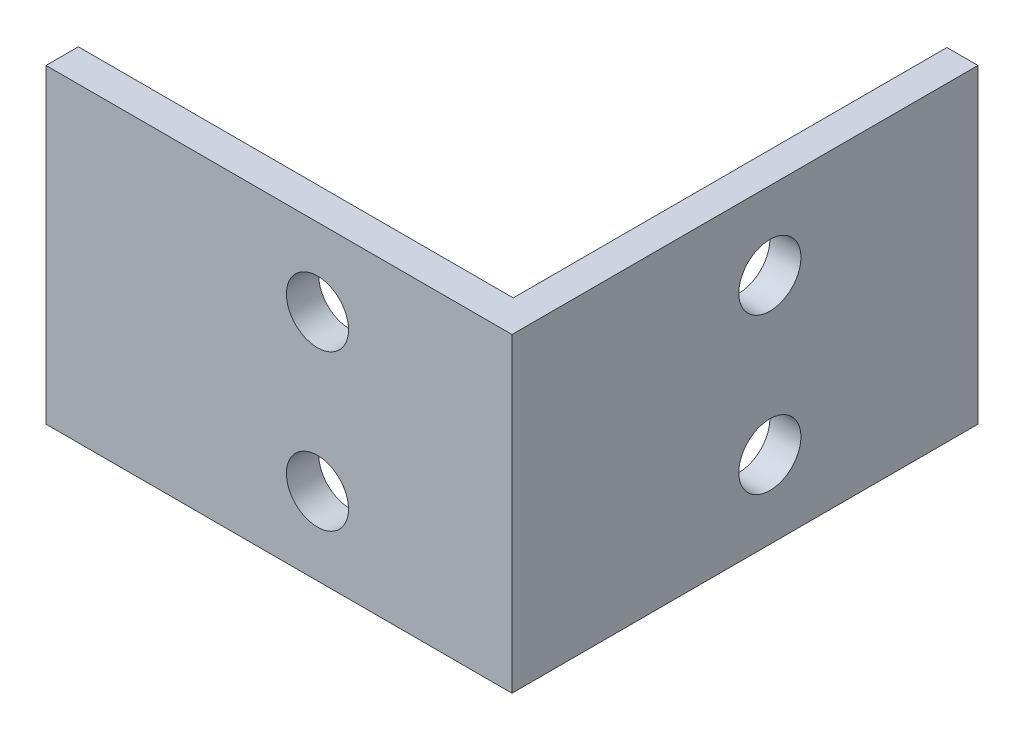
ISO-10303-21;
HEADER;
FILE_DESCRIPTION(('STEP AP214'),'2;1');
FILE_NAME('part.step','',(''),(''),'','','');
FILE_SCHEMA(('AUTOMOTIVE_DESIGN { 1 0 10303 214 1 1 1 1 }'));
ENDSEC;
DATA;
#1=APPLICATION_CONTEXT('core data for automotive mechanical design processes');
#2=APPLICATION_PROTOCOL_DEFINITION('international standard','automotive_design',2000,#1);
#3=PRODUCT_CONTEXT('',#1,'mechanical');
#4=PRODUCT('Part','Part','',(#3));
#5=PRODUCT_RELATED_PRODUCT_CATEGORY('part','',(#4));
#6=PRODUCT_DEFINITION_FORMATION('','',#4);
#7=PRODUCT_DEFINITION_CONTEXT('part definition',#1,'design');
#8=PRODUCT_DEFINITION('design','',#6,#7);
#9=PRODUCT_DEFINITION_SHAPE('','',#8);
#10=(LENGTH_UNIT() NAMED_UNIT(*) SI_UNIT(.MILLI.,.METRE.));
#11=(NAMED_UNIT(*) PLANE_ANGLE_UNIT() SI_UNIT($,.RADIAN.));
#12=(NAMED_UNIT(*) SI_UNIT($,.STERADIAN.) SOLID_ANGLE_UNIT());
#13=UNCERTAINTY_MEASURE_WITH_UNIT(LENGTH_MEASURE(1.E-05),#10,'distance_accuracy_value','');
#14=(GEOMETRIC_REPRESENTATION_CONTEXT(3) GLOBAL_UNCERTAINTY_ASSIGNED_CONTEXT((#13)) GLOBAL_UNIT_ASSIGNED_CONTEXT((#10,
#11,#12)) REPRESENTATION_CONTEXT('',''));
#15=CARTESIAN_POINT('',(0.,0.,0.));
#16=DIRECTION('',(0.,0.,1.));
#17=DIRECTION('',(1.,0.,0.));
#18=AXIS2_PLACEMENT_3D('',#15,#16,#17);
#19=CARTESIAN_POINT('',(2.,20.,-13.3999999999999));
#20=DIRECTION('',(0.,0.,1.));
#21=DIRECTION('',(1.,0.,0.));
#22=AXIS2_PLACEMENT_3D('',#19,#20,#21);
#23=PLANE('',#22);
#24=DIRECTION('',(-1.,0.,0.));
#25=VECTOR('',#24,1.);
#26=CARTESIAN_POINT('',(2.,0.,-13.3999999999999));
#27=LINE('',#26,#25);
#28=CARTESIAN_POINT('',(2.,0.,-13.3999999999999));
#29=VERTEX_POINT('',#28);
#30=CARTESIAN_POINT('',(0.,0.,-13.3999999999999));
#31=VERTEX_POINT('',#30);
#32=EDGE_CURVE('E130',#29,#31,#27,.T.);
#33=ORIENTED_EDGE('',*,*,#32,.T.);
#34=DIRECTION('',(0.,-1.,0.));
#35=VECTOR('',#34,1.);
#36=CARTESIAN_POINT('',(0.,20.,-13.3999999999999));
#37=LINE('',#36,#35);
#38=CARTESIAN_POINT('',(0.,20.,-13.3999999999999));
#39=VERTEX_POINT('',#38);
#40=EDGE_CURVE('E11',#39,#31,#37,.T.);
#41=ORIENTED_EDGE('',*,*,#40,.F.);
#42=DIRECTION('',(-1.,0.,0.));
#43=VECTOR('',#42,1.);
#44=CARTESIAN_POINT('',(2.,20.,-13.3999999999999));
#45=LINE('',#44,#43);
#46=CARTESIAN_POINT('',(2.,20.,-13.3999999999999));
#47=VERTEX_POINT('',#46);
#48=EDGE_CURVE('E146',#47,#39,#45,.T.);
#49=ORIENTED_EDGE('',*,*,#48,.F.);
#50=DIRECTION('',(0.,-1.,0.));
#51=VECTOR('',#50,1.);
#52=CARTESIAN_POINT('',(2.,20.,-13.3999999999999));
#53=LINE('',#52,#51);
#54=EDGE_CURVE('E126',#47,#29,#53,.T.);
#55=ORIENTED_EDGE('',*,*,#54,.T.);
#56=EDGE_LOOP('',(#33,#41,#49,#55));
#57=FACE_BOUND('',#56,.T.);
#58=ADVANCED_FACE('F39',(#57),#23,.F.);
#59=CARTESIAN_POINT('',(0.,20.,-13.3999999999999));
#60=DIRECTION('',(1.,0.,0.));
#61=DIRECTION('',(0.,0.,-1.));
#62=AXIS2_PLACEMENT_3D('',#59,#60,#61);
#63=PLANE('',#62);
#64=CARTESIAN_POINT('',(0.,15.,0.));
#65=DIRECTION('',(1.,0.,0.));
#66=DIRECTION('',(0.,0.,-1.));
#67=AXIS2_PLACEMENT_3D('',#64,#65,#66);
#68=CIRCLE('',#67,2.);
#69=CARTESIAN_POINT('',(0.,15.,2.));
#70=VERTEX_POINT('',#69);
#71=EDGE_CURVE('E158',#70,#70,#68,.F.);
#72=ORIENTED_EDGE('',*,*,#71,.F.);
#73=EDGE_LOOP('',(#72));
#74=FACE_BOUND('',#73,.T.);
#75=CARTESIAN_POINT('',(0.,5.,0.));
#76=DIRECTION('',(1.,0.,0.));
#77=DIRECTION('',(0.,0.,-1.));
#78=AXIS2_PLACEMENT_3D('',#75,#76,#77);
#79=CIRCLE('',#78,2.);
#80=CARTESIAN_POINT('',(0.,5.,2.));
#81=VERTEX_POINT('',#80);
#82=EDGE_CURVE('E165',#81,#81,#79,.F.);
#83=ORIENTED_EDGE('',*,*,#82,.F.);
#84=EDGE_LOOP('',(#83));
#85=FACE_BOUND('',#84,.T.);
#86=DIRECTION('',(0.,0.,1.));
#87=VECTOR('',#86,1.);
#88=CARTESIAN_POINT('',(0.,0.,-13.3999999999999));
#89=LINE('',#88,#87);
#90=CARTESIAN_POINT('',(0.,0.,14.5200000000001));
#91=VERTEX_POINT('',#90);
#92=EDGE_CURVE('E134',#31,#91,#89,.T.);
#93=ORIENTED_EDGE('',*,*,#92,.T.);
#94=DIRECTION('',(0.,-1.,0.));
#95=VECTOR('',#94,1.);
#96=CARTESIAN_POINT('',(0.,20.,14.5200000000001));
#97=LINE('',#96,#95);
#98=CARTESIAN_POINT('',(0.,20.,14.5200000000001));
#99=VERTEX_POINT('',#98);
#100=EDGE_CURVE('E49',#99,#91,#97,.T.);
#101=ORIENTED_EDGE('',*,*,#100,.F.);
#102=DIRECTION('',(0.,0.,1.));
#103=VECTOR('',#102,1.);
#104=CARTESIAN_POINT('',(0.,20.,-13.3999999999999));
#105=LINE('',#104,#103);
#106=EDGE_CURVE('E95',#39,#99,#105,.T.);
#107=ORIENTED_EDGE('',*,*,#106,.F.);
#108=ORIENTED_EDGE('',*,*,#40,.T.);
#109=EDGE_LOOP('',(#93,#101,#107,#108));
#110=FACE_BOUND('',#109,.T.);
#111=ADVANCED_FACE('F183',(#74,#85,#110),#63,.F.);
#112=CARTESIAN_POINT('',(0.,20.,14.5200000000001));
#113=DIRECTION('',(0.,0.,1.));
#114=DIRECTION('',(1.,0.,0.));
#115=AXIS2_PLACEMENT_3D('',#112,#113,#114);
#116=PLANE('',#115);
#117=CARTESIAN_POINT('',(-10.523881441582,5.,14.5200000000001));
#118=DIRECTION('',(0.,0.,1.));
#119=DIRECTION('',(1.,0.,0.));
#120=AXIS2_PLACEMENT_3D('',#117,#118,#119);
#121=CIRCLE('',#120,2.);
#122=CARTESIAN_POINT('',(-8.52388144158201,5.,14.5200000000001));
#123=VERTEX_POINT('',#122);
#124=EDGE_CURVE('E171',#123,#123,#121,.F.);
#125=ORIENTED_EDGE('',*,*,#124,.F.);
#126=EDGE_LOOP('',(#125));
#127=FACE_BOUND('',#126,.T.);
#128=CARTESIAN_POINT('',(-10.523881441582,15.,14.5200000000001));
#129=DIRECTION('',(0.,0.,1.));
#130=DIRECTION('',(1.,0.,0.));
#131=AXIS2_PLACEMENT_3D('',#128,#129,#130);
#132=CIRCLE('',#131,2.);
#133=CARTESIAN_POINT('',(-8.52388144158201,15.,14.5200000000001));
#134=VERTEX_POINT('',#133);
#135=EDGE_CURVE('E312',#134,#134,#132,.F.);
#136=ORIENTED_EDGE('',*,*,#135,.F.);
#137=EDGE_LOOP('',(#136));
#138=FACE_BOUND('',#137,.T.);
#139=DIRECTION('',(-1.,0.,0.));
#140=VECTOR('',#139,1.);
#141=CARTESIAN_POINT('',(0.,0.,14.5200000000001));
#142=LINE('',#141,#140);
#143=CARTESIAN_POINT('',(-28.,0.,14.5200000000001));
#144=VERTEX_POINT('',#143);
#145=EDGE_CURVE('E137',#91,#144,#142,.T.);
#146=ORIENTED_EDGE('',*,*,#145,.T.);
#147=DIRECTION('',(0.,-1.,0.));
#148=VECTOR('',#147,1.);
#149=CARTESIAN_POINT('',(-28.,20.,14.5200000000001));
#150=LINE('',#149,#148);
#151=CARTESIAN_POINT('',(-28.,20.,14.5200000000001));
#152=VERTEX_POINT('',#151);
#153=EDGE_CURVE('E119',#152,#144,#150,.T.);
#154=ORIENTED_EDGE('',*,*,#153,.F.);
#155=DIRECTION('',(-1.,0.,0.));
#156=VECTOR('',#155,1.);
#157=CARTESIAN_POINT('',(0.,20.,14.5200000000001));
#158=LINE('',#157,#156);
#159=EDGE_CURVE('E108',#99,#152,#158,.T.);
#160=ORIENTED_EDGE('',*,*,#159,.F.);
#161=ORIENTED_EDGE('',*,*,#100,.T.);
#162=EDGE_LOOP('',(#146,#154,#160,#161));
#163=FACE_BOUND('',#162,.T.);
#164=ADVANCED_FACE('F186',(#127,#138,#163),#116,.F.);
#165=CARTESIAN_POINT('',(-28.,20.,14.5200000000001));
#166=DIRECTION('',(1.,0.,0.));
#167=DIRECTION('',(0.,0.,-1.));
#168=AXIS2_PLACEMENT_3D('',#165,#166,#167);
#169=PLANE('',#168);
#170=DIRECTION('',(0.,0.,1.));
#171=VECTOR('',#170,1.);
#172=CARTESIAN_POINT('',(-28.,0.,14.5200000000001));
#173=LINE('',#172,#171);
#174=CARTESIAN_POINT('',(-28.,0.,16.6000000000001));
#175=VERTEX_POINT('',#174);
#176=EDGE_CURVE('E117',#144,#175,#173,.T.);
#177=ORIENTED_EDGE('',*,*,#176,.T.);
#178=DIRECTION('',(0.,-1.,0.));
#179=VECTOR('',#178,1.);
#180=CARTESIAN_POINT('',(-28.,20.,16.6000000000001));
#181=LINE('',#180,#179);
#182=CARTESIAN_POINT('',(-28.,20.,16.6000000000001));
#183=VERTEX_POINT('',#182);
#184=EDGE_CURVE('E114',#183,#175,#181,.T.);
#185=ORIENTED_EDGE('',*,*,#184,.F.);
#186=DIRECTION('',(0.,0.,1.));
#187=VECTOR('',#186,1.);
#188=CARTESIAN_POINT('',(-28.,20.,14.5200000000001));
#189=LINE('',#188,#187);
#190=EDGE_CURVE('E102',#152,#183,#189,.T.);
#191=ORIENTED_EDGE('',*,*,#190,.F.);
#192=ORIENTED_EDGE('',*,*,#153,.T.);
#193=EDGE_LOOP('',(#177,#185,#191,#192));
#194=FACE_BOUND('',#193,.T.);
#195=ADVANCED_FACE('F115',(#194),#169,.F.);
#196=CARTESIAN_POINT('',(-28.,20.,16.6000000000001));
#197=DIRECTION('',(0.,0.,-1.));
#198=DIRECTION('',(-1.,0.,0.));
#199=AXIS2_PLACEMENT_3D('',#196,#197,#198);
#200=PLANE('',#199);
#201=CARTESIAN_POINT('',(-10.523881441582,5.,16.6000000000001));
#202=DIRECTION('',(0.,0.,1.));
#203=DIRECTION('',(1.,0.,0.));
#204=AXIS2_PLACEMENT_3D('',#201,#202,#203);
#205=CIRCLE('',#204,2.);
#206=CARTESIAN_POINT('',(-8.52388144158201,5.,16.6000000000001));
#207=VERTEX_POINT('',#206);
#208=EDGE_CURVE('E305',#207,#207,#205,.T.);
#209=ORIENTED_EDGE('',*,*,#208,.F.);
#210=EDGE_LOOP('',(#209));
#211=FACE_BOUND('',#210,.T.);
#212=CARTESIAN_POINT('',(-10.523881441582,15.,16.6000000000001));
#213=DIRECTION('',(0.,0.,1.));
#214=DIRECTION('',(1.,0.,0.));
#215=AXIS2_PLACEMENT_3D('',#212,#213,#214);
#216=CIRCLE('',#215,2.);
#217=CARTESIAN_POINT('',(-8.52388144158201,15.,16.6000000000001));
#218=VERTEX_POINT('',#217);
#219=EDGE_CURVE('E174',#218,#218,#216,.T.);
#220=ORIENTED_EDGE('',*,*,#219,.F.);
#221=EDGE_LOOP('',(#220));
#222=FACE_BOUND('',#221,.T.);
#223=DIRECTION('',(1.,0.,0.));
#224=VECTOR('',#223,1.);
#225=CARTESIAN_POINT('',(-28.,0.,16.6000000000001));
#226=LINE('',#225,#224);
#227=CARTESIAN_POINT('',(2.,0.,16.6000000000001));
#228=VERTEX_POINT('',#227);
#229=EDGE_CURVE('E81',#175,#228,#226,.T.);
#230=ORIENTED_EDGE('',*,*,#229,.T.);
#231=DIRECTION('',(0.,-1.,0.));
#232=VECTOR('',#231,1.);
#233=CARTESIAN_POINT('',(2.,20.,16.6000000000001));
#234=LINE('',#233,#232);
#235=CARTESIAN_POINT('',(2.,20.,16.6000000000001));
#236=VERTEX_POINT('',#235);
#237=EDGE_CURVE('E120',#236,#228,#234,.T.);
#238=ORIENTED_EDGE('',*,*,#237,.F.);
#239=DIRECTION('',(1.,0.,0.));
#240=VECTOR('',#239,1.);
#241=CARTESIAN_POINT('',(-28.,20.,16.6000000000001));
#242=LINE('',#241,#240);
#243=EDGE_CURVE('E106',#183,#236,#242,.T.);
#244=ORIENTED_EDGE('',*,*,#243,.F.);
#245=ORIENTED_EDGE('',*,*,#184,.T.);
#246=EDGE_LOOP('',(#230,#238,#244,#245));
#247=FACE_BOUND('',#246,.T.);
#248=ADVANCED_FACE('F122',(#211,#222,#247),#200,.F.);
#249=CARTESIAN_POINT('',(2.,20.,16.6000000000001));
#250=DIRECTION('',(-1.,0.,0.));
#251=DIRECTION('',(0.,0.,1.));
#252=AXIS2_PLACEMENT_3D('',#249,#250,#251);
#253=PLANE('',#252);
#254=CARTESIAN_POINT('',(2.,15.,0.));
#255=DIRECTION('',(-1.,0.,0.));
#256=DIRECTION('',(0.,0.,1.));
#257=AXIS2_PLACEMENT_3D('',#254,#255,#256);
#258=CIRCLE('',#257,2.);
#259=CARTESIAN_POINT('',(2.,15.,2.));
#260=VERTEX_POINT('',#259);
#261=EDGE_CURVE('E42',#260,#260,#258,.F.);
#262=ORIENTED_EDGE('',*,*,#261,.F.);
#263=EDGE_LOOP('',(#262));
#264=FACE_BOUND('',#263,.T.);
#265=CARTESIAN_POINT('',(2.,5.,0.));
#266=DIRECTION('',(-1.,0.,0.));
#267=DIRECTION('',(0.,0.,1.));
#268=AXIS2_PLACEMENT_3D('',#265,#266,#267);
#269=CIRCLE('',#268,2.);
#270=CARTESIAN_POINT('',(2.,5.,2.));
#271=VERTEX_POINT('',#270);
#272=EDGE_CURVE('E155',#271,#271,#269,.F.);
#273=ORIENTED_EDGE('',*,*,#272,.F.);
#274=EDGE_LOOP('',(#273));
#275=FACE_BOUND('',#274,.T.);
#276=DIRECTION('',(0.,0.,-1.));
#277=VECTOR('',#276,1.);
#278=CARTESIAN_POINT('',(2.,0.,16.6000000000001));
#279=LINE('',#278,#277);
#280=EDGE_CURVE('E87',#228,#29,#279,.T.);
#281=ORIENTED_EDGE('',*,*,#280,.T.);
#282=ORIENTED_EDGE('',*,*,#54,.F.);
#283=DIRECTION('',(0.,0.,-1.));
#284=VECTOR('',#283,1.);
#285=CARTESIAN_POINT('',(2.,20.,16.6000000000001));
#286=LINE('',#285,#284);
#287=EDGE_CURVE('E58',#236,#47,#286,.T.);
#288=ORIENTED_EDGE('',*,*,#287,.F.);
#289=ORIENTED_EDGE('',*,*,#237,.T.);
#290=EDGE_LOOP('',(#281,#282,#288,#289));
#291=FACE_BOUND('',#290,.T.);
#292=ADVANCED_FACE('F191',(#264,#275,#291),#253,.F.);
#293=CARTESIAN_POINT('',(0.,20.,0.));
#294=DIRECTION('',(0.,1.,0.));
#295=DIRECTION('',(0.,0.,1.));
#296=AXIS2_PLACEMENT_3D('',#293,#294,#295);
#297=PLANE('',#296);
#298=ORIENTED_EDGE('',*,*,#48,.T.);
#299=ORIENTED_EDGE('',*,*,#106,.T.);
#300=ORIENTED_EDGE('',*,*,#159,.T.);
#301=ORIENTED_EDGE('',*,*,#190,.T.);
#302=ORIENTED_EDGE('',*,*,#243,.T.);
#303=ORIENTED_EDGE('',*,*,#287,.T.);
#304=EDGE_LOOP('',(#298,#299,#300,#301,#302,#303));
#305=FACE_BOUND('',#304,.T.);
#306=ADVANCED_FACE('F104',(#305),#297,.T.);
#307=CARTESIAN_POINT('',(0.,0.,0.));
#308=DIRECTION('',(0.,1.,0.));
#309=DIRECTION('',(0.,0.,1.));
#310=AXIS2_PLACEMENT_3D('',#307,#308,#309);
#311=PLANE('',#310);
#312=ORIENTED_EDGE('',*,*,#32,.F.);
#313=ORIENTED_EDGE('',*,*,#280,.F.);
#314=ORIENTED_EDGE('',*,*,#229,.F.);
#315=ORIENTED_EDGE('',*,*,#176,.F.);
#316=ORIENTED_EDGE('',*,*,#145,.F.);
#317=ORIENTED_EDGE('',*,*,#92,.F.);
#318=EDGE_LOOP('',(#312,#313,#314,#315,#316,#317));
#319=FACE_BOUND('',#318,.T.);
#320=ADVANCED_FACE('F189',(#319),#311,.F.);
#321=CARTESIAN_POINT('',(2.000012,5.,0.));
#322=DIRECTION('',(-1.,0.,0.));
#323=DIRECTION('',(0.,0.,1.));
#324=AXIS2_PLACEMENT_3D('',#321,#322,#323);
#325=CYLINDRICAL_SURFACE('',#324,2.);
#326=CARTESIAN_POINT('',(0.,5.,2.));
#327=CARTESIAN_POINT('',(0.0208333333333333,5.,2.));
#328=CARTESIAN_POINT('',(0.0416666666666666,5.,2.));
#329=CARTESIAN_POINT('',(0.0833333333333332,5.,2.));
#330=CARTESIAN_POINT('',(0.104166666666667,5.,2.));
#331=CARTESIAN_POINT('',(0.145833333333333,5.,2.));
#332=CARTESIAN_POINT('',(0.166666666666667,5.,2.));
#333=CARTESIAN_POINT('',(0.208333333333333,5.,2.));
#334=CARTESIAN_POINT('',(0.229166666666667,5.,2.));
#335=CARTESIAN_POINT('',(0.270833333333333,5.,2.));
#336=CARTESIAN_POINT('',(0.291666666666667,5.,2.));
#337=CARTESIAN_POINT('',(0.333333333333333,5.,2.));
#338=CARTESIAN_POINT('',(0.354166666666667,5.,2.));
#339=CARTESIAN_POINT('',(0.395833333333333,5.,2.));
#340=CARTESIAN_POINT('',(0.416666666666667,5.,2.));
#341=CARTESIAN_POINT('',(0.458333333333333,5.,2.));
#342=CARTESIAN_POINT('',(0.479166666666667,5.,2.));
#343=CARTESIAN_POINT('',(0.520833333333333,5.,2.));
#344=CARTESIAN_POINT('',(0.541666666666667,5.,2.));
#345=CARTESIAN_POINT('',(0.583333333333333,5.,2.));
#346=CARTESIAN_POINT('',(0.604166666666667,5.,2.));
#347=CARTESIAN_POINT('',(0.645833333333333,5.,2.));
#348=CARTESIAN_POINT('',(0.666666666666667,5.,2.));
#349=CARTESIAN_POINT('',(0.708333333333333,5.,2.));
#350=CARTESIAN_POINT('',(0.729166666666667,5.,2.));
#351=CARTESIAN_POINT('',(0.770833333333333,5.,2.));
#352=CARTESIAN_POINT('',(0.791666666666667,5.,2.));
#353=CARTESIAN_POINT('',(0.833333333333333,5.,2.));
#354=CARTESIAN_POINT('',(0.854166666666667,5.,2.));
#355=CARTESIAN_POINT('',(0.895833333333333,5.,2.));
#356=CARTESIAN_POINT('',(0.916666666666667,5.,2.));
#357=CARTESIAN_POINT('',(0.958333333333333,5.,2.));
#358=CARTESIAN_POINT('',(0.979166666666667,5.,2.));
#359=CARTESIAN_POINT('',(1.02083333333333,5.,2.));
#360=CARTESIAN_POINT('',(1.04166666666667,5.,2.));
#361=CARTESIAN_POINT('',(1.08333333333333,5.,2.));
#362=CARTESIAN_POINT('',(1.10416666666667,5.,2.));
#363=CARTESIAN_POINT('',(1.14583333333333,5.,2.));
#364=CARTESIAN_POINT('',(1.16666666666667,5.,2.));
#365=CARTESIAN_POINT('',(1.20833333333333,5.,2.));
#366=CARTESIAN_POINT('',(1.22916666666667,5.,2.));
#367=CARTESIAN_POINT('',(1.27083333333333,5.,2.));
#368=CARTESIAN_POINT('',(1.29166666666667,5.,2.));
#369=CARTESIAN_POINT('',(1.33333333333333,5.,2.));
#370=CARTESIAN_POINT('',(1.35416666666667,5.,2.));
#371=CARTESIAN_POINT('',(1.39583333333333,5.,2.));
#372=CARTESIAN_POINT('',(1.41666666666667,5.,2.));
#373=CARTESIAN_POINT('',(1.45833333333333,5.,2.));
#374=CARTESIAN_POINT('',(1.47916666666667,5.,2.));
#375=CARTESIAN_POINT('',(1.52083333333333,5.,2.));
#376=CARTESIAN_POINT('',(1.54166666666667,5.,2.));
#377=CARTESIAN_POINT('',(1.58333333333333,5.,2.));
#378=CARTESIAN_POINT('',(1.60416666666667,5.,2.));
#379=CARTESIAN_POINT('',(1.64583333333333,5.,2.));
#380=CARTESIAN_POINT('',(1.66666666666667,5.,2.));
#381=CARTESIAN_POINT('',(1.70833333333333,5.,2.));
#382=CARTESIAN_POINT('',(1.72916666666667,5.,2.));
#383=CARTESIAN_POINT('',(1.77083333333333,5.,2.));
#384=CARTESIAN_POINT('',(1.79166666666667,5.,2.));
#385=CARTESIAN_POINT('',(1.83333333333333,5.,2.));
#386=CARTESIAN_POINT('',(1.85416666666667,5.,2.));
#387=CARTESIAN_POINT('',(1.89583333333333,5.,2.));
#388=CARTESIAN_POINT('',(1.91666666666667,5.,2.));
#389=CARTESIAN_POINT('',(1.95833333333333,5.,2.));
#390=CARTESIAN_POINT('',(1.97916666666667,5.,2.));
#391=CARTESIAN_POINT('',(2.,5.,2.));
#392=B_SPLINE_CURVE_WITH_KNOTS('',3,(#326,#327,#328,#329,#330,#331,#332,#333,#334,#335,#336,
#337,#338,#339,#340,#341,#342,#343,#344,#345,#346,#347,#348,#349,#350,#351,#352,#353,#354,#355,
#356,#357,#358,#359,#360,#361,#362,#363,#364,#365,#366,#367,#368,#369,#370,#371,#372,#373,#374,
#375,#376,#377,#378,#379,#380,#381,#382,#383,#384,#385,#386,#387,#388,#389,#390,#391),
.UNSPECIFIED.,.F.,.F.,(4,2,2,2,2,2,2,2,2,2,2,2,2,2,2,2,2,2,2,2,2,2,2,2,2,2,2,2,2,2,2,2,4),(0.,
0.0624999999999998,0.125,0.1875,0.25,0.3125,0.375,0.4375,0.5,0.5625,0.625,0.6875,0.75,0.8125,
0.875,0.9375,1.,1.0625,1.125,1.1875,1.25,1.3125,1.375,1.4375,1.5,1.5625,1.625,1.6875,1.75,
1.8125,1.875,1.9375,2.),.UNSPECIFIED.);
#393=EDGE_CURVE('BSEAM262',#81,#271,#392,.T.);
#394=ORIENTED_EDGE('',*,*,#82,.T.);
#395=ORIENTED_EDGE('',*,*,#272,.T.);
#396=ORIENTED_EDGE('',*,*,#393,.T.);
#397=ORIENTED_EDGE('',*,*,#393,.F.);
#398=EDGE_LOOP('',(#394,#396,#395,#397));
#399=FACE_BOUND('',#398,.T.);
#400=ADVANCED_FACE('F262',(#399),#325,.F.);
#401=CARTESIAN_POINT('',(2.000012,15.,0.));
#402=DIRECTION('',(-1.,0.,0.));
#403=DIRECTION('',(0.,0.,1.));
#404=AXIS2_PLACEMENT_3D('',#401,#402,#403);
#405=CYLINDRICAL_SURFACE('',#404,2.);
#406=CARTESIAN_POINT('',(0.,15.,2.));
#407=CARTESIAN_POINT('',(0.0208333333333333,15.,2.));
#408=CARTESIAN_POINT('',(0.0416666666666666,15.,2.));
#409=CARTESIAN_POINT('',(0.0833333333333332,15.,2.));
#410=CARTESIAN_POINT('',(0.104166666666667,15.,2.));
#411=CARTESIAN_POINT('',(0.145833333333333,15.,2.));
#412=CARTESIAN_POINT('',(0.166666666666667,15.,2.));
#413=CARTESIAN_POINT('',(0.208333333333333,15.,2.));
#414=CARTESIAN_POINT('',(0.229166666666667,15.,2.));
#415=CARTESIAN_POINT('',(0.270833333333333,15.,2.));
#416=CARTESIAN_POINT('',(0.291666666666667,15.,2.));
#417=CARTESIAN_POINT('',(0.333333333333333,15.,2.));
#418=CARTESIAN_POINT('',(0.354166666666667,15.,2.));
#419=CARTESIAN_POINT('',(0.395833333333333,15.,2.));
#420=CARTESIAN_POINT('',(0.416666666666667,15.,2.));
#421=CARTESIAN_POINT('',(0.458333333333333,15.,2.));
#422=CARTESIAN_POINT('',(0.479166666666667,15.,2.));
#423=CARTESIAN_POINT('',(0.520833333333333,15.,2.));
#424=CARTESIAN_POINT('',(0.541666666666667,15.,2.));
#425=CARTESIAN_POINT('',(0.583333333333333,15.,2.));
#426=CARTESIAN_POINT('',(0.604166666666667,15.,2.));
#427=CARTESIAN_POINT('',(0.645833333333333,15.,2.));
#428=CARTESIAN_POINT('',(0.666666666666667,15.,2.));
#429=CARTESIAN_POINT('',(0.708333333333333,15.,2.));
#430=CARTESIAN_POINT('',(0.729166666666667,15.,2.));
#431=CARTESIAN_POINT('',(0.770833333333333,15.,2.));
#432=CARTESIAN_POINT('',(0.791666666666667,15.,2.));
#433=CARTESIAN_POINT('',(0.833333333333333,15.,2.));
#434=CARTESIAN_POINT('',(0.854166666666667,15.,2.));
#435=CARTESIAN_POINT('',(0.895833333333333,15.,2.));
#436=CARTESIAN_POINT('',(0.916666666666667,15.,2.));
#437=CARTESIAN_POINT('',(0.958333333333333,15.,2.));
#438=CARTESIAN_POINT('',(0.979166666666667,15.,2.));
#439=CARTESIAN_POINT('',(1.02083333333333,15.,2.));
#440=CARTESIAN_POINT('',(1.04166666666667,15.,2.));
#441=CARTESIAN_POINT('',(1.08333333333333,15.,2.));
#442=CARTESIAN_POINT('',(1.10416666666667,15.,2.));
#443=CARTESIAN_POINT('',(1.14583333333333,15.,2.));
#444=CARTESIAN_POINT('',(1.16666666666667,15.,2.));
#445=CARTESIAN_POINT('',(1.20833333333333,15.,2.));
#446=CARTESIAN_POINT('',(1.22916666666667,15.,2.));
#447=CARTESIAN_POINT('',(1.27083333333333,15.,2.));
#448=CARTESIAN_POINT('',(1.29166666666667,15.,2.));
#449=CARTESIAN_POINT('',(1.33333333333333,15.,2.));
#450=CARTESIAN_POINT('',(1.35416666666667,15.,2.));
#451=CARTESIAN_POINT('',(1.39583333333333,15.,2.));
#452=CARTESIAN_POINT('',(1.41666666666667,15.,2.));
#453=CARTESIAN_POINT('',(1.45833333333333,15.,2.));
#454=CARTESIAN_POINT('',(1.47916666666667,15.,2.));
#455=CARTESIAN_POINT('',(1.52083333333333,15.,2.));
#456=CARTESIAN_POINT('',(1.54166666666667,15.,2.));
#457=CARTESIAN_POINT('',(1.58333333333333,15.,2.));
#458=CARTESIAN_POINT('',(1.60416666666667,15.,2.));
#459=CARTESIAN_POINT('',(1.64583333333333,15.,2.));
#460=CARTESIAN_POINT('',(1.66666666666667,15.,2.));
#461=CARTESIAN_POINT('',(1.70833333333333,15.,2.));
#462=CARTESIAN_POINT('',(1.72916666666667,15.,2.));
#463=CARTESIAN_POINT('',(1.77083333333333,15.,2.));
#464=CARTESIAN_POINT('',(1.79166666666667,15.,2.));
#465=CARTESIAN_POINT('',(1.83333333333333,15.,2.));
#466=CARTESIAN_POINT('',(1.85416666666667,15.,2.));
#467=CARTESIAN_POINT('',(1.89583333333333,15.,2.));
#468=CARTESIAN_POINT('',(1.91666666666667,15.,2.));
#469=CARTESIAN_POINT('',(1.95833333333333,15.,2.));
#470=CARTESIAN_POINT('',(1.97916666666667,15.,2.));
#471=CARTESIAN_POINT('',(2.,15.,2.));
#472=B_SPLINE_CURVE_WITH_KNOTS('',3,(#406,#407,#408,#409,#410,#411,#412,#413,#414,#415,#416,
#417,#418,#419,#420,#421,#422,#423,#424,#425,#426,#427,#428,#429,#430,#431,#432,#433,#434,#435,
#436,#437,#438,#439,#440,#441,#442,#443,#444,#445,#446,#447,#448,#449,#450,#451,#452,#453,#454,
#455,#456,#457,#458,#459,#460,#461,#462,#463,#464,#465,#466,#467,#468,#469,#470,#471),
.UNSPECIFIED.,.F.,.F.,(4,2,2,2,2,2,2,2,2,2,2,2,2,2,2,2,2,2,2,2,2,2,2,2,2,2,2,2,2,2,2,2,4),(0.,
0.0624999999999998,0.125,0.1875,0.25,0.3125,0.375,0.4375,0.5,0.5625,0.625,0.6875,0.75,0.8125,
0.875,0.9375,1.,1.0625,1.125,1.1875,1.25,1.3125,1.375,1.4375,1.5,1.5625,1.625,1.6875,1.75,
1.8125,1.875,1.9375,2.),.UNSPECIFIED.);
#473=EDGE_CURVE('BSEAM242',#70,#260,#472,.T.);
#474=ORIENTED_EDGE('',*,*,#71,.T.);
#475=ORIENTED_EDGE('',*,*,#261,.T.);
#476=ORIENTED_EDGE('',*,*,#473,.T.);
#477=ORIENTED_EDGE('',*,*,#473,.F.);
#478=EDGE_LOOP('',(#474,#476,#475,#477));
#479=FACE_BOUND('',#478,.T.);
#480=ADVANCED_FACE('F242',(#479),#405,.F.);
#481=CARTESIAN_POINT('',(-10.523881441582,15.,-13.4009999999999));
#482=DIRECTION('',(0.,0.,1.));
#483=DIRECTION('',(1.,0.,0.));
#484=AXIS2_PLACEMENT_3D('',#481,#482,#483);
#485=CYLINDRICAL_SURFACE('',#484,2.);
#486=ORIENTED_EDGE('',*,*,#219,.T.);
#487=EDGE_LOOP('',(#486));
#488=FACE_BOUND('',#487,.T.);
#489=ORIENTED_EDGE('',*,*,#135,.T.);
#490=EDGE_LOOP('',(#489));
#491=FACE_BOUND('',#490,.T.);
#492=ADVANCED_FACE('F236',(#488,#491),#485,.F.);
#493=CARTESIAN_POINT('',(-10.523881441582,5.,-13.4009999999999));
#494=DIRECTION('',(0.,0.,1.));
#495=DIRECTION('',(1.,0.,0.));
#496=AXIS2_PLACEMENT_3D('',#493,#494,#495);
#497=CYLINDRICAL_SURFACE('',#496,2.);
#498=ORIENTED_EDGE('',*,*,#208,.T.);
#499=EDGE_LOOP('',(#498));
#500=FACE_BOUND('',#499,.T.);
#501=ORIENTED_EDGE('',*,*,#124,.T.);
#502=EDGE_LOOP('',(#501));
#503=FACE_BOUND('',#502,.T.);
#504=ADVANCED_FACE('F241',(#500,#503),#497,.F.);
#505=CLOSED_SHELL('',(#58,#111,#164,#195,#248,#292,#306,#320,#400,#480,#492,#504));
#506=MANIFOLD_SOLID_BREP('B2',#505);
#507=ADVANCED_BREP_SHAPE_REPRESENTATION('',(#18,#506),#14);
#508=SHAPE_DEFINITION_REPRESENTATION(#9,#507);
ENDSEC;
END-ISO-10303-21;
